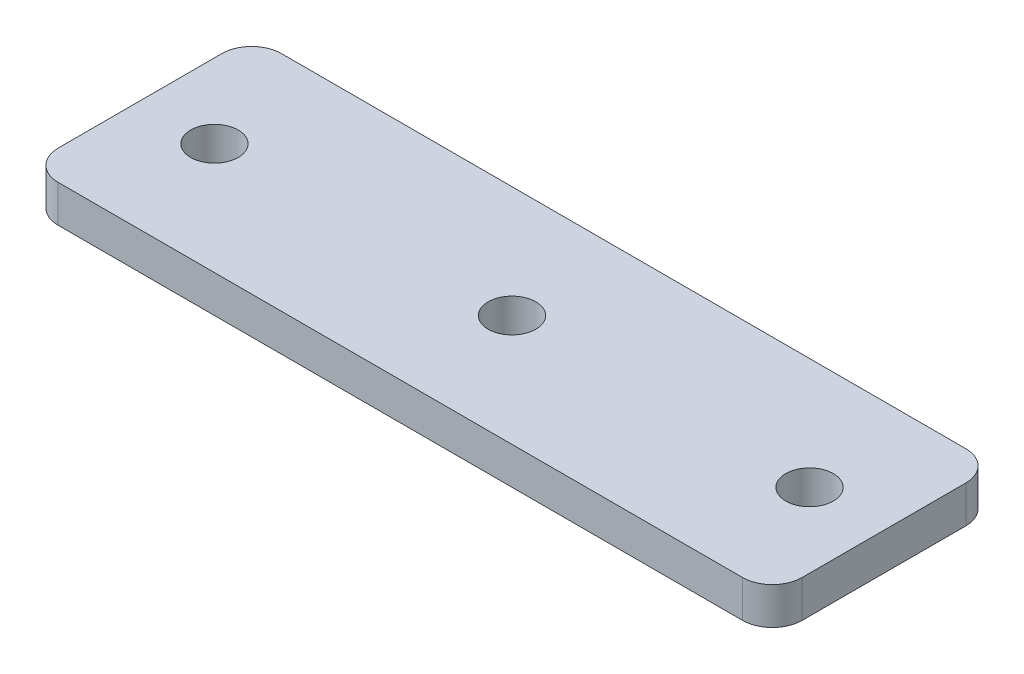
ISO-10303-21;
HEADER;
FILE_DESCRIPTION(('STEP AP214'),'2;1');
FILE_NAME('part.step','',(''),(''),'','','');
FILE_SCHEMA(('AUTOMOTIVE_DESIGN { 1 0 10303 214 1 1 1 1 }'));
ENDSEC;
DATA;
#1=APPLICATION_CONTEXT('core data for automotive mechanical design processes');
#2=APPLICATION_PROTOCOL_DEFINITION('international standard','automotive_design',2000,#1);
#3=PRODUCT_CONTEXT('',#1,'mechanical');
#4=PRODUCT('Part','Part','',(#3));
#5=PRODUCT_RELATED_PRODUCT_CATEGORY('part','',(#4));
#6=PRODUCT_DEFINITION_FORMATION('','',#4);
#7=PRODUCT_DEFINITION_CONTEXT('part definition',#1,'design');
#8=PRODUCT_DEFINITION('design','',#6,#7);
#9=PRODUCT_DEFINITION_SHAPE('','',#8);
#10=(LENGTH_UNIT() NAMED_UNIT(*) SI_UNIT(.MILLI.,.METRE.));
#11=(NAMED_UNIT(*) PLANE_ANGLE_UNIT() SI_UNIT($,.RADIAN.));
#12=(NAMED_UNIT(*) SI_UNIT($,.STERADIAN.) SOLID_ANGLE_UNIT());
#13=UNCERTAINTY_MEASURE_WITH_UNIT(LENGTH_MEASURE(1.E-05),#10,'distance_accuracy_value','');
#14=(GEOMETRIC_REPRESENTATION_CONTEXT(3) GLOBAL_UNCERTAINTY_ASSIGNED_CONTEXT((#13)) GLOBAL_UNIT_ASSIGNED_CONTEXT((#10,
#11,#12)) REPRESENTATION_CONTEXT('',''));
#15=CARTESIAN_POINT('',(0.,0.,0.));
#16=DIRECTION('',(0.,0.,1.));
#17=DIRECTION('',(1.,0.,0.));
#18=AXIS2_PLACEMENT_3D('',#15,#16,#17);
#19=CARTESIAN_POINT('',(25.,2.5,7.5));
#20=DIRECTION('',(-1.,0.,0.));
#21=DIRECTION('',(0.,0.,1.));
#22=AXIS2_PLACEMENT_3D('',#19,#20,#21);
#23=PLANE('',#22);
#24=DIRECTION('',(0.,0.,-1.));
#25=VECTOR('',#24,1.);
#26=CARTESIAN_POINT('',(25.,0.,7.5));
#27=LINE('',#26,#25);
#28=CARTESIAN_POINT('',(25.,0.,5.5));
#29=VERTEX_POINT('',#28);
#30=CARTESIAN_POINT('',(25.,0.,-5.5));
#31=VERTEX_POINT('',#30);
#32=EDGE_CURVE('E146',#29,#31,#27,.T.);
#33=ORIENTED_EDGE('',*,*,#32,.T.);
#34=DIRECTION('',(0.,-1.,0.));
#35=VECTOR('',#34,1.);
#36=CARTESIAN_POINT('',(25.,2.5,-5.5));
#37=LINE('',#36,#35);
#38=CARTESIAN_POINT('',(25.,2.5,-5.5));
#39=VERTEX_POINT('',#38);
#40=EDGE_CURVE('E120',#31,#39,#37,.F.);
#41=ORIENTED_EDGE('',*,*,#40,.T.);
#42=DIRECTION('',(0.,0.,-1.));
#43=VECTOR('',#42,1.);
#44=CARTESIAN_POINT('',(25.,2.5,7.5));
#45=LINE('',#44,#43);
#46=CARTESIAN_POINT('',(25.,2.5,5.5));
#47=VERTEX_POINT('',#46);
#48=EDGE_CURVE('E159',#47,#39,#45,.T.);
#49=ORIENTED_EDGE('',*,*,#48,.F.);
#50=DIRECTION('',(0.,-1.,0.));
#51=VECTOR('',#50,1.);
#52=CARTESIAN_POINT('',(25.,2.5,5.5));
#53=LINE('',#52,#51);
#54=EDGE_CURVE('E126',#47,#29,#53,.T.);
#55=ORIENTED_EDGE('',*,*,#54,.T.);
#56=EDGE_LOOP('',(#33,#41,#49,#55));
#57=FACE_BOUND('',#56,.T.);
#58=ADVANCED_FACE('F47',(#57),#23,.F.);
#59=CARTESIAN_POINT('',(-25.,2.5,-7.5));
#60=DIRECTION('',(0.,0.,1.));
#61=DIRECTION('',(1.,0.,0.));
#62=AXIS2_PLACEMENT_3D('',#59,#60,#61);
#63=PLANE('',#62);
#64=DIRECTION('',(-1.,0.,0.));
#65=VECTOR('',#64,1.);
#66=CARTESIAN_POINT('',(-25.,2.5,-7.5));
#67=LINE('',#66,#65);
#68=CARTESIAN_POINT('',(23.,2.5,-7.5));
#69=VERTEX_POINT('',#68);
#70=CARTESIAN_POINT('',(-23.,2.5,-7.5));
#71=VERTEX_POINT('',#70);
#72=EDGE_CURVE('E136',#69,#71,#67,.T.);
#73=ORIENTED_EDGE('',*,*,#72,.F.);
#74=DIRECTION('',(0.,-1.,0.));
#75=VECTOR('',#74,1.);
#76=CARTESIAN_POINT('',(23.,2.5,-7.5));
#77=LINE('',#76,#75);
#78=CARTESIAN_POINT('',(23.,0.,-7.5));
#79=VERTEX_POINT('',#78);
#80=EDGE_CURVE('E119',#69,#79,#77,.T.);
#81=ORIENTED_EDGE('',*,*,#80,.T.);
#82=DIRECTION('',(-1.,0.,0.));
#83=VECTOR('',#82,1.);
#84=CARTESIAN_POINT('',(-25.,0.,-7.5));
#85=LINE('',#84,#83);
#86=CARTESIAN_POINT('',(-23.,0.,-7.5));
#87=VERTEX_POINT('',#86);
#88=EDGE_CURVE('E133',#79,#87,#85,.T.);
#89=ORIENTED_EDGE('',*,*,#88,.T.);
#90=DIRECTION('',(0.,-1.,0.));
#91=VECTOR('',#90,1.);
#92=CARTESIAN_POINT('',(-23.,2.5,-7.5));
#93=LINE('',#92,#91);
#94=EDGE_CURVE('E139',#87,#71,#93,.F.);
#95=ORIENTED_EDGE('',*,*,#94,.T.);
#96=EDGE_LOOP('',(#73,#81,#89,#95));
#97=FACE_BOUND('',#96,.T.);
#98=ADVANCED_FACE('F132',(#97),#63,.F.);
#99=CARTESIAN_POINT('',(-25.,2.5,7.5));
#100=DIRECTION('',(1.,0.,0.));
#101=DIRECTION('',(0.,0.,-1.));
#102=AXIS2_PLACEMENT_3D('',#99,#100,#101);
#103=PLANE('',#102);
#104=DIRECTION('',(0.,0.,1.));
#105=VECTOR('',#104,1.);
#106=CARTESIAN_POINT('',(-25.,2.5,7.5));
#107=LINE('',#106,#105);
#108=CARTESIAN_POINT('',(-25.,2.5,-5.5));
#109=VERTEX_POINT('',#108);
#110=CARTESIAN_POINT('',(-25.,2.5,5.5));
#111=VERTEX_POINT('',#110);
#112=EDGE_CURVE('E195',#109,#111,#107,.T.);
#113=ORIENTED_EDGE('',*,*,#112,.F.);
#114=DIRECTION('',(0.,-1.,0.));
#115=VECTOR('',#114,1.);
#116=CARTESIAN_POINT('',(-25.,2.5,-5.5));
#117=LINE('',#116,#115);
#118=CARTESIAN_POINT('',(-25.,0.,-5.5));
#119=VERTEX_POINT('',#118);
#120=EDGE_CURVE('E11',#109,#119,#117,.T.);
#121=ORIENTED_EDGE('',*,*,#120,.T.);
#122=DIRECTION('',(0.,0.,1.));
#123=VECTOR('',#122,1.);
#124=CARTESIAN_POINT('',(-25.,0.,7.5));
#125=LINE('',#124,#123);
#126=CARTESIAN_POINT('',(-25.,0.,5.5));
#127=VERTEX_POINT('',#126);
#128=EDGE_CURVE('E145',#119,#127,#125,.T.);
#129=ORIENTED_EDGE('',*,*,#128,.T.);
#130=DIRECTION('',(0.,-1.,0.));
#131=VECTOR('',#130,1.);
#132=CARTESIAN_POINT('',(-25.,2.5,5.5));
#133=LINE('',#132,#131);
#134=EDGE_CURVE('E56',#127,#111,#133,.F.);
#135=ORIENTED_EDGE('',*,*,#134,.T.);
#136=EDGE_LOOP('',(#113,#121,#129,#135));
#137=FACE_BOUND('',#136,.T.);
#138=ADVANCED_FACE('F194',(#137),#103,.F.);
#139=CARTESIAN_POINT('',(-25.,2.5,7.5));
#140=DIRECTION('',(0.,0.,-1.));
#141=DIRECTION('',(-1.,0.,0.));
#142=AXIS2_PLACEMENT_3D('',#139,#140,#141);
#143=PLANE('',#142);
#144=DIRECTION('',(1.,0.,0.));
#145=VECTOR('',#144,1.);
#146=CARTESIAN_POINT('',(-25.,0.,7.5));
#147=LINE('',#146,#145);
#148=CARTESIAN_POINT('',(-23.,0.,7.5));
#149=VERTEX_POINT('',#148);
#150=CARTESIAN_POINT('',(23.,0.,7.5));
#151=VERTEX_POINT('',#150);
#152=EDGE_CURVE('E151',#149,#151,#147,.T.);
#153=ORIENTED_EDGE('',*,*,#152,.T.);
#154=DIRECTION('',(0.,-1.,0.));
#155=VECTOR('',#154,1.);
#156=CARTESIAN_POINT('',(23.,2.5,7.5));
#157=LINE('',#156,#155);
#158=CARTESIAN_POINT('',(23.,2.5,7.5));
#159=VERTEX_POINT('',#158);
#160=EDGE_CURVE('E63',#151,#159,#157,.F.);
#161=ORIENTED_EDGE('',*,*,#160,.T.);
#162=DIRECTION('',(1.,0.,0.));
#163=VECTOR('',#162,1.);
#164=CARTESIAN_POINT('',(-25.,2.5,7.5));
#165=LINE('',#164,#163);
#166=CARTESIAN_POINT('',(-23.,2.5,7.5));
#167=VERTEX_POINT('',#166);
#168=EDGE_CURVE('E161',#167,#159,#165,.T.);
#169=ORIENTED_EDGE('',*,*,#168,.F.);
#170=DIRECTION('',(0.,-1.,0.));
#171=VECTOR('',#170,1.);
#172=CARTESIAN_POINT('',(-23.,2.5,7.5));
#173=LINE('',#172,#171);
#174=EDGE_CURVE('E185',#167,#149,#173,.T.);
#175=ORIENTED_EDGE('',*,*,#174,.T.);
#176=EDGE_LOOP('',(#153,#161,#169,#175));
#177=FACE_BOUND('',#176,.T.);
#178=ADVANCED_FACE('F205',(#177),#143,.F.);
#179=CARTESIAN_POINT('',(0.,2.5,0.));
#180=DIRECTION('',(0.,-1.,0.));
#181=DIRECTION('',(0.,0.,-1.));
#182=AXIS2_PLACEMENT_3D('',#179,#180,#181);
#183=PLANE('',#182);
#184=CARTESIAN_POINT('',(20.,2.5,0.));
#185=DIRECTION('',(0.,1.,0.));
#186=DIRECTION('',(0.,0.,1.));
#187=AXIS2_PLACEMENT_3D('',#184,#185,#186);
#188=CIRCLE('',#187,1.6);
#189=CARTESIAN_POINT('',(20.,2.5,1.6));
#190=VERTEX_POINT('',#189);
#191=EDGE_CURVE('E230',#190,#190,#188,.T.);
#192=ORIENTED_EDGE('',*,*,#191,.F.);
#193=EDGE_LOOP('',(#192));
#194=FACE_BOUND('',#193,.T.);
#195=CARTESIAN_POINT('',(-20.,2.5,0.));
#196=DIRECTION('',(0.,1.,0.));
#197=DIRECTION('',(0.,0.,1.));
#198=AXIS2_PLACEMENT_3D('',#195,#196,#197);
#199=CIRCLE('',#198,1.6);
#200=CARTESIAN_POINT('',(-20.,2.5,1.6));
#201=VERTEX_POINT('',#200);
#202=EDGE_CURVE('E222',#201,#201,#199,.T.);
#203=ORIENTED_EDGE('',*,*,#202,.F.);
#204=EDGE_LOOP('',(#203));
#205=FACE_BOUND('',#204,.T.);
#206=CARTESIAN_POINT('',(0.,2.5,0.));
#207=DIRECTION('',(0.,1.,0.));
#208=DIRECTION('',(0.,0.,1.));
#209=AXIS2_PLACEMENT_3D('',#206,#207,#208);
#210=CIRCLE('',#209,1.6);
#211=CARTESIAN_POINT('',(0.,2.5,1.6));
#212=VERTEX_POINT('',#211);
#213=EDGE_CURVE('E217',#212,#212,#210,.T.);
#214=ORIENTED_EDGE('',*,*,#213,.F.);
#215=EDGE_LOOP('',(#214));
#216=FACE_BOUND('',#215,.T.);
#217=ORIENTED_EDGE('',*,*,#48,.T.);
#218=CARTESIAN_POINT('',(23.,2.5,-5.5));
#219=DIRECTION('',(0.,-1.,0.));
#220=DIRECTION('',(0.,0.,-1.));
#221=AXIS2_PLACEMENT_3D('',#218,#219,#220);
#222=CIRCLE('',#221,2.);
#223=EDGE_CURVE('E182',#39,#69,#222,.F.);
#224=ORIENTED_EDGE('',*,*,#223,.T.);
#225=ORIENTED_EDGE('',*,*,#72,.T.);
#226=CARTESIAN_POINT('',(-23.,2.5,-5.5));
#227=DIRECTION('',(0.,-1.,0.));
#228=DIRECTION('',(0.,0.,-1.));
#229=AXIS2_PLACEMENT_3D('',#226,#227,#228);
#230=CIRCLE('',#229,2.);
#231=EDGE_CURVE('E176',#71,#109,#230,.F.);
#232=ORIENTED_EDGE('',*,*,#231,.T.);
#233=ORIENTED_EDGE('',*,*,#112,.T.);
#234=CARTESIAN_POINT('',(-23.,2.5,5.5));
#235=DIRECTION('',(0.,-1.,0.));
#236=DIRECTION('',(0.,0.,-1.));
#237=AXIS2_PLACEMENT_3D('',#234,#235,#236);
#238=CIRCLE('',#237,2.);
#239=EDGE_CURVE('E70',#111,#167,#238,.F.);
#240=ORIENTED_EDGE('',*,*,#239,.T.);
#241=ORIENTED_EDGE('',*,*,#168,.T.);
#242=CARTESIAN_POINT('',(23.,2.5,5.5));
#243=DIRECTION('',(0.,-1.,0.));
#244=DIRECTION('',(0.,0.,-1.));
#245=AXIS2_PLACEMENT_3D('',#242,#243,#244);
#246=CIRCLE('',#245,2.);
#247=EDGE_CURVE('E179',#159,#47,#246,.F.);
#248=ORIENTED_EDGE('',*,*,#247,.T.);
#249=EDGE_LOOP('',(#217,#224,#225,#232,#233,#240,#241,#248));
#250=FACE_BOUND('',#249,.T.);
#251=ADVANCED_FACE('F199',(#194,#205,#216,#250),#183,.F.);
#252=CARTESIAN_POINT('',(0.,0.,0.));
#253=DIRECTION('',(0.,-1.,0.));
#254=DIRECTION('',(0.,0.,-1.));
#255=AXIS2_PLACEMENT_3D('',#252,#253,#254);
#256=PLANE('',#255);
#257=CARTESIAN_POINT('',(20.,0.,0.));
#258=DIRECTION('',(0.,1.,0.));
#259=DIRECTION('',(0.,0.,1.));
#260=AXIS2_PLACEMENT_3D('',#257,#258,#259);
#261=CIRCLE('',#260,1.6);
#262=CARTESIAN_POINT('',(20.,0.,1.6));
#263=VERTEX_POINT('',#262);
#264=EDGE_CURVE('E226',#263,#263,#261,.T.);
#265=ORIENTED_EDGE('',*,*,#264,.T.);
#266=EDGE_LOOP('',(#265));
#267=FACE_BOUND('',#266,.T.);
#268=CARTESIAN_POINT('',(-20.,0.,0.));
#269=DIRECTION('',(0.,1.,0.));
#270=DIRECTION('',(0.,0.,1.));
#271=AXIS2_PLACEMENT_3D('',#268,#269,#270);
#272=CIRCLE('',#271,1.6);
#273=CARTESIAN_POINT('',(-20.,0.,1.6));
#274=VERTEX_POINT('',#273);
#275=EDGE_CURVE('E234',#274,#274,#272,.T.);
#276=ORIENTED_EDGE('',*,*,#275,.T.);
#277=EDGE_LOOP('',(#276));
#278=FACE_BOUND('',#277,.T.);
#279=CARTESIAN_POINT('',(0.,0.,0.));
#280=DIRECTION('',(0.,1.,0.));
#281=DIRECTION('',(0.,0.,1.));
#282=AXIS2_PLACEMENT_3D('',#279,#280,#281);
#283=CIRCLE('',#282,1.6);
#284=CARTESIAN_POINT('',(0.,0.,1.6));
#285=VERTEX_POINT('',#284);
#286=EDGE_CURVE('E153',#285,#285,#283,.T.);
#287=ORIENTED_EDGE('',*,*,#286,.T.);
#288=EDGE_LOOP('',(#287));
#289=FACE_BOUND('',#288,.T.);
#290=ORIENTED_EDGE('',*,*,#88,.F.);
#291=CARTESIAN_POINT('',(23.,0.,-5.5));
#292=DIRECTION('',(0.,-1.,0.));
#293=DIRECTION('',(0.,0.,-1.));
#294=AXIS2_PLACEMENT_3D('',#291,#292,#293);
#295=CIRCLE('',#294,2.);
#296=EDGE_CURVE('E115',#79,#31,#295,.T.);
#297=ORIENTED_EDGE('',*,*,#296,.T.);
#298=ORIENTED_EDGE('',*,*,#32,.F.);
#299=CARTESIAN_POINT('',(23.,0.,5.5));
#300=DIRECTION('',(0.,-1.,0.));
#301=DIRECTION('',(0.,0.,-1.));
#302=AXIS2_PLACEMENT_3D('',#299,#300,#301);
#303=CIRCLE('',#302,2.);
#304=EDGE_CURVE('E127',#29,#151,#303,.T.);
#305=ORIENTED_EDGE('',*,*,#304,.T.);
#306=ORIENTED_EDGE('',*,*,#152,.F.);
#307=CARTESIAN_POINT('',(-23.,0.,5.5));
#308=DIRECTION('',(0.,-1.,0.));
#309=DIRECTION('',(0.,0.,-1.));
#310=AXIS2_PLACEMENT_3D('',#307,#308,#309);
#311=CIRCLE('',#310,2.);
#312=EDGE_CURVE('E138',#149,#127,#311,.T.);
#313=ORIENTED_EDGE('',*,*,#312,.T.);
#314=ORIENTED_EDGE('',*,*,#128,.F.);
#315=CARTESIAN_POINT('',(-23.,0.,-5.5));
#316=DIRECTION('',(0.,-1.,0.));
#317=DIRECTION('',(0.,0.,-1.));
#318=AXIS2_PLACEMENT_3D('',#315,#316,#317);
#319=CIRCLE('',#318,2.);
#320=EDGE_CURVE('E143',#119,#87,#319,.T.);
#321=ORIENTED_EDGE('',*,*,#320,.T.);
#322=EDGE_LOOP('',(#290,#297,#298,#305,#306,#313,#314,#321));
#323=FACE_BOUND('',#322,.T.);
#324=ADVANCED_FACE('F141',(#267,#278,#289,#323),#256,.T.);
#325=CARTESIAN_POINT('',(0.,0.,0.));
#326=DIRECTION('',(0.,1.,0.));
#327=DIRECTION('',(0.,0.,1.));
#328=AXIS2_PLACEMENT_3D('',#325,#326,#327);
#329=CYLINDRICAL_SURFACE('',#328,1.6);
#330=ORIENTED_EDGE('',*,*,#286,.F.);
#331=EDGE_LOOP('',(#330));
#332=FACE_BOUND('',#331,.T.);
#333=ORIENTED_EDGE('',*,*,#213,.T.);
#334=EDGE_LOOP('',(#333));
#335=FACE_BOUND('',#334,.T.);
#336=ADVANCED_FACE('F250',(#332,#335),#329,.F.);
#337=CARTESIAN_POINT('',(-20.,0.,0.));
#338=DIRECTION('',(0.,1.,0.));
#339=DIRECTION('',(0.,0.,1.));
#340=AXIS2_PLACEMENT_3D('',#337,#338,#339);
#341=CYLINDRICAL_SURFACE('',#340,1.6);
#342=ORIENTED_EDGE('',*,*,#275,.F.);
#343=EDGE_LOOP('',(#342));
#344=FACE_BOUND('',#343,.T.);
#345=ORIENTED_EDGE('',*,*,#202,.T.);
#346=EDGE_LOOP('',(#345));
#347=FACE_BOUND('',#346,.T.);
#348=ADVANCED_FACE('F242',(#344,#347),#341,.F.);
#349=CARTESIAN_POINT('',(20.,0.,0.));
#350=DIRECTION('',(0.,1.,0.));
#351=DIRECTION('',(0.,0.,1.));
#352=AXIS2_PLACEMENT_3D('',#349,#350,#351);
#353=CYLINDRICAL_SURFACE('',#352,1.6);
#354=ORIENTED_EDGE('',*,*,#264,.F.);
#355=EDGE_LOOP('',(#354));
#356=FACE_BOUND('',#355,.T.);
#357=ORIENTED_EDGE('',*,*,#191,.T.);
#358=EDGE_LOOP('',(#357));
#359=FACE_BOUND('',#358,.T.);
#360=ADVANCED_FACE('F257',(#356,#359),#353,.F.);
#361=CARTESIAN_POINT('',(23.,2.5,-5.5));
#362=DIRECTION('',(0.,-1.,0.));
#363=DIRECTION('',(0.,0.,-1.));
#364=AXIS2_PLACEMENT_3D('',#361,#362,#363);
#365=CYLINDRICAL_SURFACE('',#364,2.);
#366=ORIENTED_EDGE('',*,*,#223,.F.);
#367=ORIENTED_EDGE('',*,*,#40,.F.);
#368=ORIENTED_EDGE('',*,*,#296,.F.);
#369=ORIENTED_EDGE('',*,*,#80,.F.);
#370=EDGE_LOOP('',(#366,#367,#368,#369));
#371=FACE_BOUND('',#370,.T.);
#372=ADVANCED_FACE('F118',(#371),#365,.T.);
#373=CARTESIAN_POINT('',(23.,2.5,5.5));
#374=DIRECTION('',(0.,-1.,0.));
#375=DIRECTION('',(0.,0.,-1.));
#376=AXIS2_PLACEMENT_3D('',#373,#374,#375);
#377=CYLINDRICAL_SURFACE('',#376,2.);
#378=ORIENTED_EDGE('',*,*,#247,.F.);
#379=ORIENTED_EDGE('',*,*,#160,.F.);
#380=ORIENTED_EDGE('',*,*,#304,.F.);
#381=ORIENTED_EDGE('',*,*,#54,.F.);
#382=EDGE_LOOP('',(#378,#379,#380,#381));
#383=FACE_BOUND('',#382,.T.);
#384=ADVANCED_FACE('F209',(#383),#377,.T.);
#385=CARTESIAN_POINT('',(-23.,2.5,-5.5));
#386=DIRECTION('',(0.,-1.,0.));
#387=DIRECTION('',(0.,0.,-1.));
#388=AXIS2_PLACEMENT_3D('',#385,#386,#387);
#389=CYLINDRICAL_SURFACE('',#388,2.);
#390=ORIENTED_EDGE('',*,*,#231,.F.);
#391=ORIENTED_EDGE('',*,*,#94,.F.);
#392=ORIENTED_EDGE('',*,*,#320,.F.);
#393=ORIENTED_EDGE('',*,*,#120,.F.);
#394=EDGE_LOOP('',(#390,#391,#392,#393));
#395=FACE_BOUND('',#394,.T.);
#396=ADVANCED_FACE('F277',(#395),#389,.T.);
#397=CARTESIAN_POINT('',(-23.,2.5,5.5));
#398=DIRECTION('',(0.,-1.,0.));
#399=DIRECTION('',(0.,0.,-1.));
#400=AXIS2_PLACEMENT_3D('',#397,#398,#399);
#401=CYLINDRICAL_SURFACE('',#400,2.);
#402=ORIENTED_EDGE('',*,*,#239,.F.);
#403=ORIENTED_EDGE('',*,*,#134,.F.);
#404=ORIENTED_EDGE('',*,*,#312,.F.);
#405=ORIENTED_EDGE('',*,*,#174,.F.);
#406=EDGE_LOOP('',(#402,#403,#404,#405));
#407=FACE_BOUND('',#406,.T.);
#408=ADVANCED_FACE('F49',(#407),#401,.T.);
#409=CLOSED_SHELL('',(#58,#98,#138,#178,#251,#324,#336,#348,#360,#372,#384,#396,#408));
#410=MANIFOLD_SOLID_BREP('B2',#409);
#411=ADVANCED_BREP_SHAPE_REPRESENTATION('',(#18,#410),#14);
#412=SHAPE_DEFINITION_REPRESENTATION(#9,#411);
ENDSEC;
END-ISO-10303-21;
